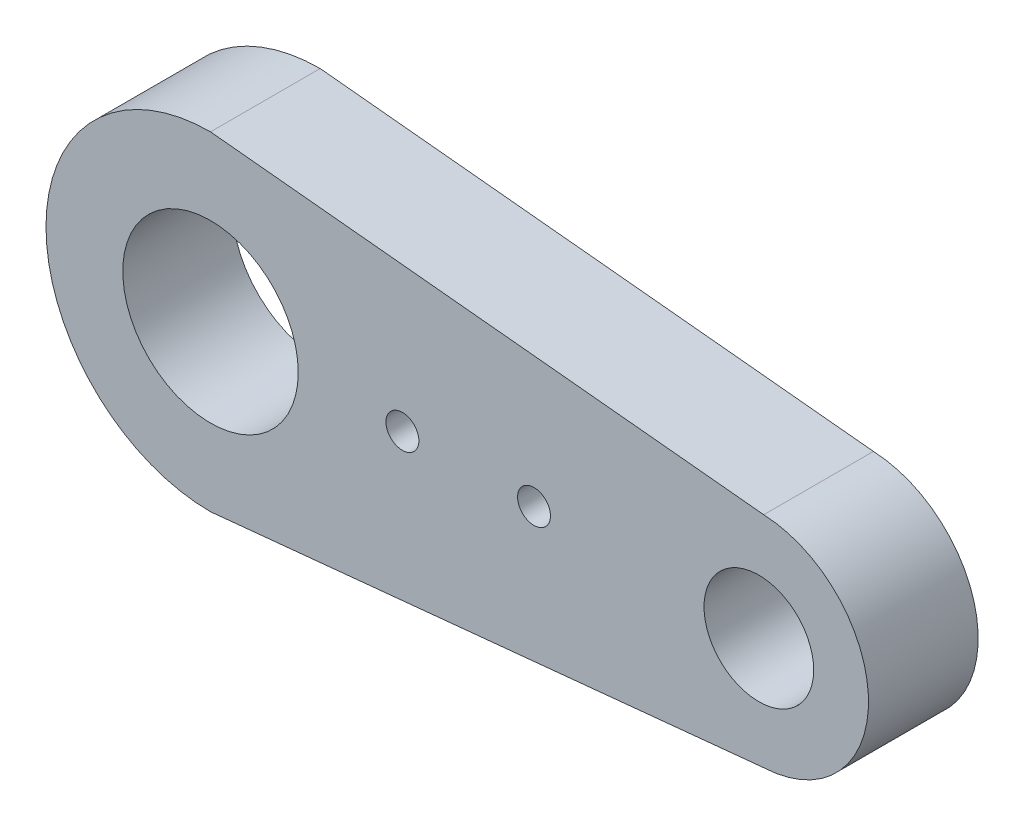
ISO-10303-21;
HEADER;
FILE_DESCRIPTION(('STEP AP214'),'2;1');
FILE_NAME('part.step','',(''),(''),'','','');
FILE_SCHEMA(('AUTOMOTIVE_DESIGN { 1 0 10303 214 1 1 1 1 }'));
ENDSEC;
DATA;
#1=APPLICATION_CONTEXT('core data for automotive mechanical design processes');
#2=APPLICATION_PROTOCOL_DEFINITION('international standard','automotive_design',2000,#1);
#3=PRODUCT_CONTEXT('',#1,'mechanical');
#4=PRODUCT('Part','Part','',(#3));
#5=PRODUCT_RELATED_PRODUCT_CATEGORY('part','',(#4));
#6=PRODUCT_DEFINITION_FORMATION('','',#4);
#7=PRODUCT_DEFINITION_CONTEXT('part definition',#1,'design');
#8=PRODUCT_DEFINITION('design','',#6,#7);
#9=PRODUCT_DEFINITION_SHAPE('','',#8);
#10=(LENGTH_UNIT() NAMED_UNIT(*) SI_UNIT(.MILLI.,.METRE.));
#11=(NAMED_UNIT(*) PLANE_ANGLE_UNIT() SI_UNIT($,.RADIAN.));
#12=(NAMED_UNIT(*) SI_UNIT($,.STERADIAN.) SOLID_ANGLE_UNIT());
#13=UNCERTAINTY_MEASURE_WITH_UNIT(LENGTH_MEASURE(1.E-05),#10,'distance_accuracy_value','');
#14=(GEOMETRIC_REPRESENTATION_CONTEXT(3) GLOBAL_UNCERTAINTY_ASSIGNED_CONTEXT((#13)) GLOBAL_UNIT_ASSIGNED_CONTEXT((#10,
#11,#12)) REPRESENTATION_CONTEXT('',''));
#15=CARTESIAN_POINT('',(0.,0.,0.));
#16=DIRECTION('',(0.,0.,1.));
#17=DIRECTION('',(1.,0.,0.));
#18=AXIS2_PLACEMENT_3D('',#15,#16,#17);
#19=CARTESIAN_POINT('',(12.5000000000057,-0.677304546205858,5.));
#20=DIRECTION('',(0.,0.,1.));
#21=DIRECTION('',(1.,0.,0.));
#22=AXIS2_PLACEMENT_3D('',#19,#20,#21);
#23=PLANE('',#22);
#24=CARTESIAN_POINT('',(-3.75013929393302,-0.627932238801562,5.));
#25=DIRECTION('',(0.,0.,1.));
#26=DIRECTION('',(1.,0.,0.));
#27=AXIS2_PLACEMENT_3D('',#24,#25,#26);
#28=CIRCLE('',#27,0.750000000000335);
#29=CARTESIAN_POINT('',(-3.00013929393268,-0.627932238801562,5.));
#30=VERTEX_POINT('',#29);
#31=EDGE_CURVE('E110',#30,#30,#28,.T.);
#32=ORIENTED_EDGE('',*,*,#31,.F.);
#33=EDGE_LOOP('',(#32));
#34=FACE_BOUND('',#33,.T.);
#35=CARTESIAN_POINT('',(2.24976519021495,-0.594076942301018,5.));
#36=DIRECTION('',(0.,0.,1.));
#37=DIRECTION('',(1.,0.,0.));
#38=AXIS2_PLACEMENT_3D('',#35,#36,#37);
#39=CIRCLE('',#38,0.750000000000396);
#40=CARTESIAN_POINT('',(2.99976519021534,-0.594076942301018,5.));
#41=VERTEX_POINT('',#40);
#42=EDGE_CURVE('E116',#41,#41,#39,.T.);
#43=ORIENTED_EDGE('',*,*,#42,.F.);
#44=EDGE_LOOP('',(#43));
#45=FACE_BOUND('',#44,.T.);
#46=CARTESIAN_POINT('',(-12.4999999999943,-0.677304546205858,5.));
#47=DIRECTION('',(0.,0.,1.));
#48=DIRECTION('',(1.,0.,0.));
#49=AXIS2_PLACEMENT_3D('',#46,#47,#48);
#50=CIRCLE('',#49,4.);
#51=CARTESIAN_POINT('',(-8.49999999999432,-0.677304546205858,5.));
#52=VERTEX_POINT('',#51);
#53=EDGE_CURVE('E103',#52,#52,#50,.T.);
#54=ORIENTED_EDGE('',*,*,#53,.F.);
#55=EDGE_LOOP('',(#54));
#56=FACE_BOUND('',#55,.T.);
#57=CARTESIAN_POINT('',(12.5000000000057,-0.677304546205858,5.));
#58=DIRECTION('',(0.,0.,1.));
#59=DIRECTION('',(1.,0.,0.));
#60=AXIS2_PLACEMENT_3D('',#57,#58,#59);
#61=CIRCLE('',#60,5.);
#62=CARTESIAN_POINT('',(12.7234478313369,-5.67230915748234,5.));
#63=VERTEX_POINT('',#62);
#64=CARTESIAN_POINT('',(12.7234478313369,4.31770006507063,5.));
#65=VERTEX_POINT('',#64);
#66=EDGE_CURVE('E87',#63,#65,#61,.T.);
#67=ORIENTED_EDGE('',*,*,#66,.T.);
#68=DIRECTION('',(-0.995104727845113,0.0988260118607605,0.));
#69=VECTOR('',#68,1.);
#70=CARTESIAN_POINT('',(-12.5,6.82269545379414,5.));
#71=LINE('',#70,#69);
#72=CARTESIAN_POINT('',(-12.5,6.82269545379414,5.));
#73=VERTEX_POINT('',#72);
#74=EDGE_CURVE('E82',#65,#73,#71,.T.);
#75=ORIENTED_EDGE('',*,*,#74,.T.);
#76=CARTESIAN_POINT('',(-12.4999999999943,-0.677304546205858,5.));
#77=DIRECTION('',(0.,0.,1.));
#78=DIRECTION('',(1.,0.,0.));
#79=AXIS2_PLACEMENT_3D('',#76,#77,#78);
#80=CIRCLE('',#79,7.5);
#81=CARTESIAN_POINT('',(-12.5,-8.17730454620586,5.));
#82=VERTEX_POINT('',#81);
#83=EDGE_CURVE('E85',#73,#82,#80,.T.);
#84=ORIENTED_EDGE('',*,*,#83,.T.);
#85=DIRECTION('',(0.995104727845113,0.0988260118607605,0.));
#86=VECTOR('',#85,1.);
#87=CARTESIAN_POINT('',(-12.5,-8.17730454620586,5.));
#88=LINE('',#87,#86);
#89=EDGE_CURVE('E52',#82,#63,#88,.T.);
#90=ORIENTED_EDGE('',*,*,#89,.T.);
#91=EDGE_LOOP('',(#67,#75,#84,#90));
#92=FACE_BOUND('',#91,.T.);
#93=CARTESIAN_POINT('',(12.5000000000057,-0.677304546205858,5.));
#94=DIRECTION('',(0.,0.,1.));
#95=DIRECTION('',(1.,0.,0.));
#96=AXIS2_PLACEMENT_3D('',#93,#94,#95);
#97=CIRCLE('',#96,2.5);
#98=CARTESIAN_POINT('',(15.0000000000057,-0.677304546205858,5.));
#99=VERTEX_POINT('',#98);
#100=EDGE_CURVE('E123',#99,#99,#97,.T.);
#101=ORIENTED_EDGE('',*,*,#100,.F.);
#102=EDGE_LOOP('',(#101));
#103=FACE_BOUND('',#102,.T.);
#104=ADVANCED_FACE('F33',(#34,#45,#56,#92,#103),#23,.T.);
#105=CARTESIAN_POINT('',(12.5000000000057,-0.677304546205858,0.));
#106=DIRECTION('',(0.,0.,1.));
#107=DIRECTION('',(1.,0.,0.));
#108=AXIS2_PLACEMENT_3D('',#105,#106,#107);
#109=PLANE('',#108);
#110=CARTESIAN_POINT('',(-3.75013929393302,-0.627932238801562,0.));
#111=DIRECTION('',(0.,0.,1.));
#112=DIRECTION('',(1.,0.,0.));
#113=AXIS2_PLACEMENT_3D('',#110,#111,#112);
#114=CIRCLE('',#113,0.750000000000335);
#115=CARTESIAN_POINT('',(-3.00013929393268,-0.627932238801562,0.));
#116=VERTEX_POINT('',#115);
#117=EDGE_CURVE('E37',#116,#116,#114,.T.);
#118=ORIENTED_EDGE('',*,*,#117,.T.);
#119=EDGE_LOOP('',(#118));
#120=FACE_BOUND('',#119,.T.);
#121=CARTESIAN_POINT('',(2.24976519021495,-0.594076942301018,0.));
#122=DIRECTION('',(0.,0.,1.));
#123=DIRECTION('',(1.,0.,0.));
#124=AXIS2_PLACEMENT_3D('',#121,#122,#123);
#125=CIRCLE('',#124,0.750000000000396);
#126=CARTESIAN_POINT('',(2.99976519021534,-0.594076942301018,0.));
#127=VERTEX_POINT('',#126);
#128=EDGE_CURVE('E108',#127,#127,#125,.T.);
#129=ORIENTED_EDGE('',*,*,#128,.T.);
#130=EDGE_LOOP('',(#129));
#131=FACE_BOUND('',#130,.T.);
#132=CARTESIAN_POINT('',(12.5000000000057,-0.677304546205858,0.));
#133=DIRECTION('',(0.,0.,1.));
#134=DIRECTION('',(1.,0.,0.));
#135=AXIS2_PLACEMENT_3D('',#132,#133,#134);
#136=CIRCLE('',#135,5.);
#137=CARTESIAN_POINT('',(12.7234478313369,-5.67230915748234,0.));
#138=VERTEX_POINT('',#137);
#139=CARTESIAN_POINT('',(12.7234478313369,4.31770006507063,0.));
#140=VERTEX_POINT('',#139);
#141=EDGE_CURVE('E100',#138,#140,#136,.T.);
#142=ORIENTED_EDGE('',*,*,#141,.F.);
#143=DIRECTION('',(0.995104727845113,0.0988260118607605,0.));
#144=VECTOR('',#143,1.);
#145=CARTESIAN_POINT('',(-12.5,-8.17730454620586,0.));
#146=LINE('',#145,#144);
#147=CARTESIAN_POINT('',(-12.5,-8.17730454620586,0.));
#148=VERTEX_POINT('',#147);
#149=EDGE_CURVE('E75',#148,#138,#146,.T.);
#150=ORIENTED_EDGE('',*,*,#149,.F.);
#151=CARTESIAN_POINT('',(-12.4999999999943,-0.677304546205858,0.));
#152=DIRECTION('',(0.,0.,1.));
#153=DIRECTION('',(1.,0.,0.));
#154=AXIS2_PLACEMENT_3D('',#151,#152,#153);
#155=CIRCLE('',#154,7.5);
#156=CARTESIAN_POINT('',(-12.5,6.82269545379414,0.));
#157=VERTEX_POINT('',#156);
#158=EDGE_CURVE('E69',#157,#148,#155,.T.);
#159=ORIENTED_EDGE('',*,*,#158,.F.);
#160=DIRECTION('',(-0.995104727845113,0.0988260118607605,0.));
#161=VECTOR('',#160,1.);
#162=CARTESIAN_POINT('',(-12.5,6.82269545379414,0.));
#163=LINE('',#162,#161);
#164=EDGE_CURVE('E91',#140,#157,#163,.T.);
#165=ORIENTED_EDGE('',*,*,#164,.F.);
#166=EDGE_LOOP('',(#142,#150,#159,#165));
#167=FACE_BOUND('',#166,.T.);
#168=CARTESIAN_POINT('',(-12.4999999999943,-0.677304546205858,0.));
#169=DIRECTION('',(0.,0.,1.));
#170=DIRECTION('',(1.,0.,0.));
#171=AXIS2_PLACEMENT_3D('',#168,#169,#170);
#172=CIRCLE('',#171,4.);
#173=CARTESIAN_POINT('',(-8.49999999999432,-0.677304546205858,0.));
#174=VERTEX_POINT('',#173);
#175=EDGE_CURVE('E126',#174,#174,#172,.T.);
#176=ORIENTED_EDGE('',*,*,#175,.T.);
#177=EDGE_LOOP('',(#176));
#178=FACE_BOUND('',#177,.T.);
#179=CARTESIAN_POINT('',(12.5000000000057,-0.677304546205858,0.));
#180=DIRECTION('',(0.,0.,1.));
#181=DIRECTION('',(1.,0.,0.));
#182=AXIS2_PLACEMENT_3D('',#179,#180,#181);
#183=CIRCLE('',#182,2.5);
#184=CARTESIAN_POINT('',(15.0000000000057,-0.677304546205858,0.));
#185=VERTEX_POINT('',#184);
#186=EDGE_CURVE('E114',#185,#185,#183,.T.);
#187=ORIENTED_EDGE('',*,*,#186,.T.);
#188=EDGE_LOOP('',(#187));
#189=FACE_BOUND('',#188,.T.);
#190=ADVANCED_FACE('F134',(#120,#131,#167,#178,#189),#109,.F.);
#191=CARTESIAN_POINT('',(12.5000000000057,-0.677304546205858,5.));
#192=DIRECTION('',(0.,0.,-1.));
#193=DIRECTION('',(-1.,0.,0.));
#194=AXIS2_PLACEMENT_3D('',#191,#192,#193);
#195=CYLINDRICAL_SURFACE('',#194,5.);
#196=ORIENTED_EDGE('',*,*,#141,.T.);
#197=DIRECTION('',(0.,0.,-1.));
#198=VECTOR('',#197,1.);
#199=CARTESIAN_POINT('',(12.7234478313369,4.31770006507063,5.));
#200=LINE('',#199,#198);
#201=EDGE_CURVE('E11',#65,#140,#200,.T.);
#202=ORIENTED_EDGE('',*,*,#201,.F.);
#203=ORIENTED_EDGE('',*,*,#66,.F.);
#204=DIRECTION('',(0.,0.,-1.));
#205=VECTOR('',#204,1.);
#206=CARTESIAN_POINT('',(12.7234478313369,-5.67230915748234,5.));
#207=LINE('',#206,#205);
#208=EDGE_CURVE('E96',#63,#138,#207,.T.);
#209=ORIENTED_EDGE('',*,*,#208,.T.);
#210=EDGE_LOOP('',(#196,#202,#203,#209));
#211=FACE_BOUND('',#210,.T.);
#212=ADVANCED_FACE('F35',(#211),#195,.T.);
#213=CARTESIAN_POINT('',(-12.5,6.82269545379414,5.));
#214=DIRECTION('',(-0.0988260118607605,-0.995104727845113,0.));
#215=DIRECTION('',(0.995104727845113,-0.0988260118607605,0.));
#216=AXIS2_PLACEMENT_3D('',#213,#214,#215);
#217=PLANE('',#216);
#218=ORIENTED_EDGE('',*,*,#164,.T.);
#219=DIRECTION('',(0.,0.,-1.));
#220=VECTOR('',#219,1.);
#221=CARTESIAN_POINT('',(-12.5,6.82269545379414,5.));
#222=LINE('',#221,#220);
#223=EDGE_CURVE('E43',#73,#157,#222,.T.);
#224=ORIENTED_EDGE('',*,*,#223,.F.);
#225=ORIENTED_EDGE('',*,*,#74,.F.);
#226=ORIENTED_EDGE('',*,*,#201,.T.);
#227=EDGE_LOOP('',(#218,#224,#225,#226));
#228=FACE_BOUND('',#227,.T.);
#229=ADVANCED_FACE('F90',(#228),#217,.F.);
#230=CARTESIAN_POINT('',(-12.4999999999943,-0.677304546205858,5.));
#231=DIRECTION('',(0.,0.,-1.));
#232=DIRECTION('',(-1.,0.,0.));
#233=AXIS2_PLACEMENT_3D('',#230,#231,#232);
#234=CYLINDRICAL_SURFACE('',#233,7.5);
#235=ORIENTED_EDGE('',*,*,#158,.T.);
#236=DIRECTION('',(0.,0.,-1.));
#237=VECTOR('',#236,1.);
#238=CARTESIAN_POINT('',(-12.5,-8.17730454620586,5.));
#239=LINE('',#238,#237);
#240=EDGE_CURVE('E92',#82,#148,#239,.T.);
#241=ORIENTED_EDGE('',*,*,#240,.F.);
#242=ORIENTED_EDGE('',*,*,#83,.F.);
#243=ORIENTED_EDGE('',*,*,#223,.T.);
#244=EDGE_LOOP('',(#235,#241,#242,#243));
#245=FACE_BOUND('',#244,.T.);
#246=ADVANCED_FACE('F94',(#245),#234,.T.);
#247=CARTESIAN_POINT('',(-12.5,-8.17730454620586,5.));
#248=DIRECTION('',(-0.0988260118607605,0.995104727845113,0.));
#249=DIRECTION('',(-0.995104727845113,-0.0988260118607605,0.));
#250=AXIS2_PLACEMENT_3D('',#247,#248,#249);
#251=PLANE('',#250);
#252=ORIENTED_EDGE('',*,*,#149,.T.);
#253=ORIENTED_EDGE('',*,*,#208,.F.);
#254=ORIENTED_EDGE('',*,*,#89,.F.);
#255=ORIENTED_EDGE('',*,*,#240,.T.);
#256=EDGE_LOOP('',(#252,#253,#254,#255));
#257=FACE_BOUND('',#256,.T.);
#258=ADVANCED_FACE('F140',(#257),#251,.F.);
#259=CARTESIAN_POINT('',(-12.4999999999943,-0.677304546205858,5.));
#260=DIRECTION('',(0.,0.,-1.));
#261=DIRECTION('',(-1.,0.,0.));
#262=AXIS2_PLACEMENT_3D('',#259,#260,#261);
#263=CYLINDRICAL_SURFACE('',#262,4.);
#264=ORIENTED_EDGE('',*,*,#53,.T.);
#265=EDGE_LOOP('',(#264));
#266=FACE_BOUND('',#265,.T.);
#267=ORIENTED_EDGE('',*,*,#175,.F.);
#268=EDGE_LOOP('',(#267));
#269=FACE_BOUND('',#268,.T.);
#270=ADVANCED_FACE('F137',(#266,#269),#263,.F.);
#271=CARTESIAN_POINT('',(12.5000000000057,-0.677304546205858,5.));
#272=DIRECTION('',(0.,0.,-1.));
#273=DIRECTION('',(-1.,0.,0.));
#274=AXIS2_PLACEMENT_3D('',#271,#272,#273);
#275=CYLINDRICAL_SURFACE('',#274,2.5);
#276=ORIENTED_EDGE('',*,*,#100,.T.);
#277=EDGE_LOOP('',(#276));
#278=FACE_BOUND('',#277,.T.);
#279=ORIENTED_EDGE('',*,*,#186,.F.);
#280=EDGE_LOOP('',(#279));
#281=FACE_BOUND('',#280,.T.);
#282=ADVANCED_FACE('F139',(#278,#281),#275,.F.);
#283=CARTESIAN_POINT('',(2.24976519021495,-0.594076942301018,-5.));
#284=DIRECTION('',(0.,0.,1.));
#285=DIRECTION('',(1.,0.,0.));
#286=AXIS2_PLACEMENT_3D('',#283,#284,#285);
#287=CYLINDRICAL_SURFACE('',#286,0.750000000000396);
#288=ORIENTED_EDGE('',*,*,#42,.T.);
#289=EDGE_LOOP('',(#288));
#290=FACE_BOUND('',#289,.T.);
#291=ORIENTED_EDGE('',*,*,#128,.F.);
#292=EDGE_LOOP('',(#291));
#293=FACE_BOUND('',#292,.T.);
#294=ADVANCED_FACE('F147',(#290,#293),#287,.F.);
#295=CARTESIAN_POINT('',(-3.75013929393302,-0.627932238801562,-5.));
#296=DIRECTION('',(0.,0.,1.));
#297=DIRECTION('',(1.,0.,0.));
#298=AXIS2_PLACEMENT_3D('',#295,#296,#297);
#299=CYLINDRICAL_SURFACE('',#298,0.750000000000335);
#300=ORIENTED_EDGE('',*,*,#31,.T.);
#301=EDGE_LOOP('',(#300));
#302=FACE_BOUND('',#301,.T.);
#303=ORIENTED_EDGE('',*,*,#117,.F.);
#304=EDGE_LOOP('',(#303));
#305=FACE_BOUND('',#304,.T.);
#306=ADVANCED_FACE('F187',(#302,#305),#299,.F.);
#307=CLOSED_SHELL('',(#104,#190,#212,#229,#246,#258,#270,#282,#294,#306));
#308=MANIFOLD_SOLID_BREP('B2',#307);
#309=ADVANCED_BREP_SHAPE_REPRESENTATION('',(#18,#308),#14);
#310=SHAPE_DEFINITION_REPRESENTATION(#9,#309);
ENDSEC;
END-ISO-10303-21;
